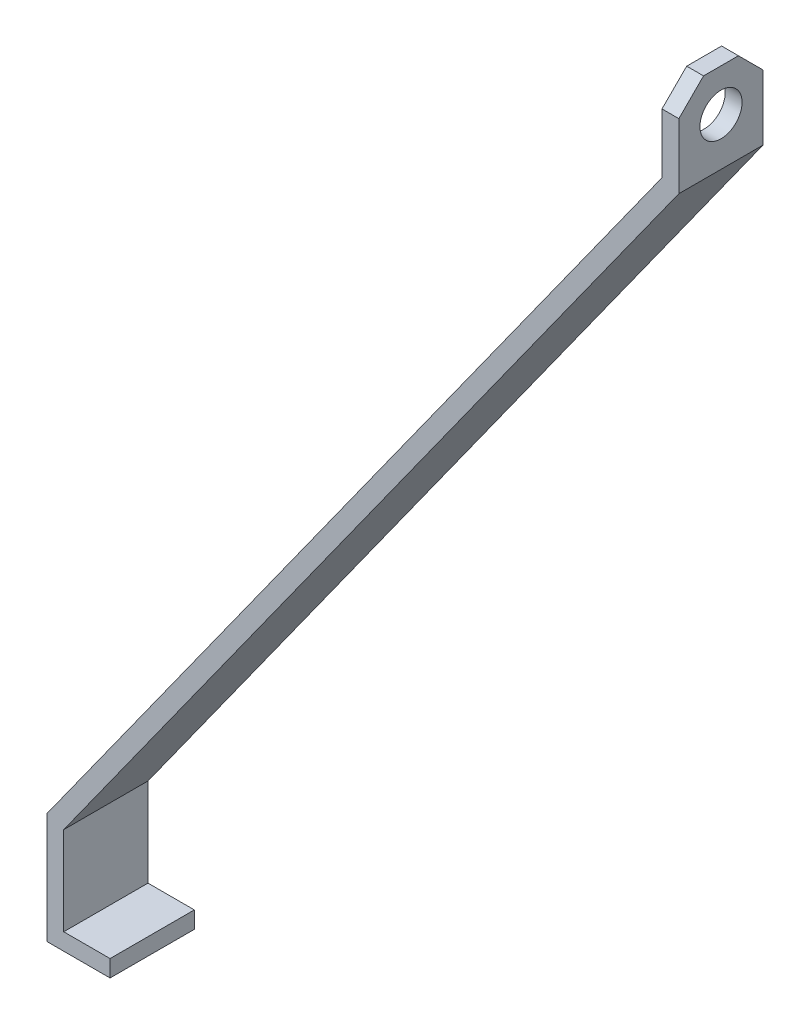
ISO-10303-21;
HEADER;
FILE_DESCRIPTION(('STEP AP214'),'2;1');
FILE_NAME('part.step','',(''),(''),'','','');
FILE_SCHEMA(('AUTOMOTIVE_DESIGN { 1 0 10303 214 1 1 1 1 }'));
ENDSEC;
DATA;
#1=APPLICATION_CONTEXT('core data for automotive mechanical design processes');
#2=APPLICATION_PROTOCOL_DEFINITION('international standard','automotive_design',2000,#1);
#3=PRODUCT_CONTEXT('',#1,'mechanical');
#4=PRODUCT('Part','Part','',(#3));
#5=PRODUCT_RELATED_PRODUCT_CATEGORY('part','',(#4));
#6=PRODUCT_DEFINITION_FORMATION('','',#4);
#7=PRODUCT_DEFINITION_CONTEXT('part definition',#1,'design');
#8=PRODUCT_DEFINITION('design','',#6,#7);
#9=PRODUCT_DEFINITION_SHAPE('','',#8);
#10=(LENGTH_UNIT() NAMED_UNIT(*) SI_UNIT(.MILLI.,.METRE.));
#11=(NAMED_UNIT(*) PLANE_ANGLE_UNIT() SI_UNIT($,.RADIAN.));
#12=(NAMED_UNIT(*) SI_UNIT($,.STERADIAN.) SOLID_ANGLE_UNIT());
#13=UNCERTAINTY_MEASURE_WITH_UNIT(LENGTH_MEASURE(1.E-05),#10,'distance_accuracy_value','');
#14=(GEOMETRIC_REPRESENTATION_CONTEXT(3) GLOBAL_UNCERTAINTY_ASSIGNED_CONTEXT((#13)) GLOBAL_UNIT_ASSIGNED_CONTEXT((#10,
#11,#12)) REPRESENTATION_CONTEXT('',''));
#15=CARTESIAN_POINT('',(0.,0.,0.));
#16=DIRECTION('',(0.,0.,1.));
#17=DIRECTION('',(1.,0.,0.));
#18=AXIS2_PLACEMENT_3D('',#15,#16,#17);
#19=CARTESIAN_POINT('',(1.6,0.,8.));
#20=DIRECTION('',(0.,-1.,0.));
#21=DIRECTION('',(1.,0.,0.));
#22=AXIS2_PLACEMENT_3D('',#19,#20,#21);
#23=PLANE('',#22);
#24=DIRECTION('',(0.,0.,-1.));
#25=VECTOR('',#24,1.);
#26=CARTESIAN_POINT('',(0.,0.,8.));
#27=LINE('',#26,#25);
#28=CARTESIAN_POINT('',(0.,0.,5.65685424949239));
#29=VERTEX_POINT('',#28);
#30=CARTESIAN_POINT('',(0.,0.,2.34314575050761));
#31=VERTEX_POINT('',#30);
#32=EDGE_CURVE('E11',#29,#31,#27,.T.);
#33=ORIENTED_EDGE('',*,*,#32,.F.);
#34=DIRECTION('',(-1.,0.,0.));
#35=VECTOR('',#34,1.);
#36=CARTESIAN_POINT('',(1.6,0.,5.65685424949239));
#37=LINE('',#36,#35);
#38=CARTESIAN_POINT('',(1.6,0.,5.65685424949239));
#39=VERTEX_POINT('',#38);
#40=EDGE_CURVE('E122',#39,#29,#37,.T.);
#41=ORIENTED_EDGE('',*,*,#40,.F.);
#42=DIRECTION('',(0.,0.,-1.));
#43=VECTOR('',#42,1.);
#44=CARTESIAN_POINT('',(1.6,0.,8.));
#45=LINE('',#44,#43);
#46=CARTESIAN_POINT('',(1.6,0.,2.34314575050761));
#47=VERTEX_POINT('',#46);
#48=EDGE_CURVE('E132',#39,#47,#45,.T.);
#49=ORIENTED_EDGE('',*,*,#48,.T.);
#50=DIRECTION('',(-1.,0.,0.));
#51=VECTOR('',#50,1.);
#52=CARTESIAN_POINT('',(1.6,0.,2.34314575050761));
#53=LINE('',#52,#51);
#54=EDGE_CURVE('E226',#47,#31,#53,.T.);
#55=ORIENTED_EDGE('',*,*,#54,.T.);
#56=EDGE_LOOP('',(#33,#41,#49,#55));
#57=FACE_BOUND('',#56,.T.);
#58=ADVANCED_FACE('F33',(#57),#23,.F.);
#59=CARTESIAN_POINT('',(0.,0.,8.));
#60=DIRECTION('',(1.,0.,0.));
#61=DIRECTION('',(0.,1.,0.));
#62=AXIS2_PLACEMENT_3D('',#59,#60,#61);
#63=PLANE('',#62);
#64=CARTESIAN_POINT('',(0.,-4.,4.));
#65=DIRECTION('',(-1.,0.,0.));
#66=DIRECTION('',(0.,-1.,0.));
#67=AXIS2_PLACEMENT_3D('',#64,#65,#66);
#68=CIRCLE('',#67,2.);
#69=CARTESIAN_POINT('',(0.,-6.,4.));
#70=VERTEX_POINT('',#69);
#71=EDGE_CURVE('E205',#70,#70,#68,.T.);
#72=ORIENTED_EDGE('',*,*,#71,.F.);
#73=EDGE_LOOP('',(#72));
#74=FACE_BOUND('',#73,.T.);
#75=DIRECTION('',(0.,-1.,0.));
#76=VECTOR('',#75,1.);
#77=CARTESIAN_POINT('',(0.,0.,8.));
#78=LINE('',#77,#76);
#79=CARTESIAN_POINT('',(0.,-2.34314575050763,8.));
#80=VERTEX_POINT('',#79);
#81=CARTESIAN_POINT('',(0.,-8.,8.));
#82=VERTEX_POINT('',#81);
#83=EDGE_CURVE('E198',#80,#82,#78,.T.);
#84=ORIENTED_EDGE('',*,*,#83,.F.);
#85=DIRECTION('',(0.,-0.707106781186551,0.707106781186544));
#86=VECTOR('',#85,1.);
#87=CARTESIAN_POINT('',(0.,-2.34314575050763,8.));
#88=LINE('',#87,#86);
#89=EDGE_CURVE('E47',#29,#80,#88,.T.);
#90=ORIENTED_EDGE('',*,*,#89,.F.);
#91=ORIENTED_EDGE('',*,*,#32,.T.);
#92=DIRECTION('',(0.,0.707106781186552,0.707106781186543));
#93=VECTOR('',#92,1.);
#94=CARTESIAN_POINT('',(0.,-2.34314575050763,0.));
#95=LINE('',#94,#93);
#96=CARTESIAN_POINT('',(0.,-2.34314575050763,0.));
#97=VERTEX_POINT('',#96);
#98=EDGE_CURVE('E229',#97,#31,#95,.T.);
#99=ORIENTED_EDGE('',*,*,#98,.F.);
#100=DIRECTION('',(0.,-1.,0.));
#101=VECTOR('',#100,1.);
#102=CARTESIAN_POINT('',(0.,0.,0.));
#103=LINE('',#102,#101);
#104=CARTESIAN_POINT('',(0.,-8.,0.));
#105=VERTEX_POINT('',#104);
#106=EDGE_CURVE('E179',#97,#105,#103,.T.);
#107=ORIENTED_EDGE('',*,*,#106,.T.);
#108=DIRECTION('',(0.,0.,-1.));
#109=VECTOR('',#108,1.);
#110=CARTESIAN_POINT('',(0.,-8.,8.));
#111=LINE('',#110,#109);
#112=EDGE_CURVE('E40',#82,#105,#111,.T.);
#113=ORIENTED_EDGE('',*,*,#112,.F.);
#114=EDGE_LOOP('',(#84,#90,#91,#99,#107,#113));
#115=FACE_BOUND('',#114,.T.);
#116=ADVANCED_FACE('F240',(#74,#115),#63,.F.);
#117=CARTESIAN_POINT('',(0.,-8.,8.));
#118=DIRECTION('',(0.812808602424598,-0.582530836801428,0.));
#119=DIRECTION('',(0.582530836801428,0.812808602424598,0.));
#120=AXIS2_PLACEMENT_3D('',#117,#118,#119);
#121=PLANE('',#120);
#122=DIRECTION('',(-0.582530836801428,-0.812808602424598,0.));
#123=VECTOR('',#122,1.);
#124=CARTESIAN_POINT('',(0.,-8.,0.));
#125=LINE('',#124,#123);
#126=CARTESIAN_POINT('',(-58.4,-89.4858534223439,0.));
#127=VERTEX_POINT('',#126);
#128=EDGE_CURVE('E171',#105,#127,#125,.T.);
#129=ORIENTED_EDGE('',*,*,#128,.T.);
#130=DIRECTION('',(0.,0.,-1.));
#131=VECTOR('',#130,1.);
#132=CARTESIAN_POINT('',(-58.4,-89.4858534223439,8.));
#133=LINE('',#132,#131);
#134=CARTESIAN_POINT('',(-58.4,-89.4858534223439,8.));
#135=VERTEX_POINT('',#134);
#136=EDGE_CURVE('E162',#135,#127,#133,.T.);
#137=ORIENTED_EDGE('',*,*,#136,.F.);
#138=DIRECTION('',(-0.582530836801428,-0.812808602424598,0.));
#139=VECTOR('',#138,1.);
#140=CARTESIAN_POINT('',(0.,-8.,8.));
#141=LINE('',#140,#139);
#142=EDGE_CURVE('E172',#82,#135,#141,.T.);
#143=ORIENTED_EDGE('',*,*,#142,.F.);
#144=ORIENTED_EDGE('',*,*,#112,.T.);
#145=EDGE_LOOP('',(#129,#137,#143,#144));
#146=FACE_BOUND('',#145,.T.);
#147=ADVANCED_FACE('F169',(#146),#121,.F.);
#148=CARTESIAN_POINT('',(-58.4,-89.4858534223439,8.));
#149=DIRECTION('',(1.,0.,0.));
#150=DIRECTION('',(0.,0.,-1.));
#151=AXIS2_PLACEMENT_3D('',#148,#149,#150);
#152=PLANE('',#151);
#153=DIRECTION('',(0.,-1.,0.));
#154=VECTOR('',#153,1.);
#155=CARTESIAN_POINT('',(-58.4,-89.4858534223439,0.));
#156=LINE('',#155,#154);
#157=CARTESIAN_POINT('',(-58.4,-100.,0.));
#158=VERTEX_POINT('',#157);
#159=EDGE_CURVE('E181',#127,#158,#156,.T.);
#160=ORIENTED_EDGE('',*,*,#159,.T.);
#161=DIRECTION('',(0.,0.,-1.));
#162=VECTOR('',#161,1.);
#163=CARTESIAN_POINT('',(-58.4,-100.,8.));
#164=LINE('',#163,#162);
#165=CARTESIAN_POINT('',(-58.4,-100.,8.));
#166=VERTEX_POINT('',#165);
#167=EDGE_CURVE('E159',#166,#158,#164,.T.);
#168=ORIENTED_EDGE('',*,*,#167,.F.);
#169=DIRECTION('',(0.,-1.,0.));
#170=VECTOR('',#169,1.);
#171=CARTESIAN_POINT('',(-58.4,-89.4858534223439,8.));
#172=LINE('',#171,#170);
#173=EDGE_CURVE('E202',#135,#166,#172,.T.);
#174=ORIENTED_EDGE('',*,*,#173,.F.);
#175=ORIENTED_EDGE('',*,*,#136,.T.);
#176=EDGE_LOOP('',(#160,#168,#174,#175));
#177=FACE_BOUND('',#176,.T.);
#178=ADVANCED_FACE('F269',(#177),#152,.F.);
#179=CARTESIAN_POINT('',(-58.4,-100.,8.));
#180=DIRECTION('',(0.,1.,0.));
#181=DIRECTION('',(0.,0.,1.));
#182=AXIS2_PLACEMENT_3D('',#179,#180,#181);
#183=PLANE('',#182);
#184=DIRECTION('',(1.,0.,0.));
#185=VECTOR('',#184,1.);
#186=CARTESIAN_POINT('',(-58.4,-100.,0.));
#187=LINE('',#186,#185);
#188=CARTESIAN_POINT('',(-52.4,-100.,0.));
#189=VERTEX_POINT('',#188);
#190=EDGE_CURVE('E183',#158,#189,#187,.T.);
#191=ORIENTED_EDGE('',*,*,#190,.T.);
#192=DIRECTION('',(0.,0.,-1.));
#193=VECTOR('',#192,1.);
#194=CARTESIAN_POINT('',(-52.4,-100.,8.));
#195=LINE('',#194,#193);
#196=CARTESIAN_POINT('',(-52.4,-100.,8.));
#197=VERTEX_POINT('',#196);
#198=EDGE_CURVE('E156',#197,#189,#195,.T.);
#199=ORIENTED_EDGE('',*,*,#198,.F.);
#200=DIRECTION('',(1.,0.,0.));
#201=VECTOR('',#200,1.);
#202=CARTESIAN_POINT('',(-58.4,-100.,8.));
#203=LINE('',#202,#201);
#204=EDGE_CURVE('E209',#166,#197,#203,.T.);
#205=ORIENTED_EDGE('',*,*,#204,.F.);
#206=ORIENTED_EDGE('',*,*,#167,.T.);
#207=EDGE_LOOP('',(#191,#199,#205,#206));
#208=FACE_BOUND('',#207,.T.);
#209=ADVANCED_FACE('F276',(#208),#183,.F.);
#210=CARTESIAN_POINT('',(-52.4,-98.4,8.));
#211=DIRECTION('',(-1.,0.,0.));
#212=DIRECTION('',(0.,0.,1.));
#213=AXIS2_PLACEMENT_3D('',#210,#211,#212);
#214=PLANE('',#213);
#215=DIRECTION('',(0.,1.,0.));
#216=VECTOR('',#215,1.);
#217=CARTESIAN_POINT('',(-52.4,-98.4,0.));
#218=LINE('',#217,#216);
#219=CARTESIAN_POINT('',(-52.4,-98.4,0.));
#220=VERTEX_POINT('',#219);
#221=EDGE_CURVE('E189',#189,#220,#218,.T.);
#222=ORIENTED_EDGE('',*,*,#221,.T.);
#223=DIRECTION('',(0.,0.,-1.));
#224=VECTOR('',#223,1.);
#225=CARTESIAN_POINT('',(-52.4,-98.4,8.));
#226=LINE('',#225,#224);
#227=CARTESIAN_POINT('',(-52.4,-98.4,8.));
#228=VERTEX_POINT('',#227);
#229=EDGE_CURVE('E153',#228,#220,#226,.T.);
#230=ORIENTED_EDGE('',*,*,#229,.F.);
#231=DIRECTION('',(0.,1.,0.));
#232=VECTOR('',#231,1.);
#233=CARTESIAN_POINT('',(-52.4,-98.4,8.));
#234=LINE('',#233,#232);
#235=EDGE_CURVE('E211',#197,#228,#234,.T.);
#236=ORIENTED_EDGE('',*,*,#235,.F.);
#237=ORIENTED_EDGE('',*,*,#198,.T.);
#238=EDGE_LOOP('',(#222,#230,#236,#237));
#239=FACE_BOUND('',#238,.T.);
#240=ADVANCED_FACE('F284',(#239),#214,.F.);
#241=CARTESIAN_POINT('',(-56.8,-98.4,8.));
#242=DIRECTION('',(0.,-1.,0.));
#243=DIRECTION('',(0.,0.,-1.));
#244=AXIS2_PLACEMENT_3D('',#241,#242,#243);
#245=PLANE('',#244);
#246=DIRECTION('',(-1.,0.,0.));
#247=VECTOR('',#246,1.);
#248=CARTESIAN_POINT('',(-56.8,-98.4,0.));
#249=LINE('',#248,#247);
#250=CARTESIAN_POINT('',(-56.8,-98.4,0.));
#251=VERTEX_POINT('',#250);
#252=EDGE_CURVE('E191',#220,#251,#249,.T.);
#253=ORIENTED_EDGE('',*,*,#252,.T.);
#254=DIRECTION('',(0.,0.,-1.));
#255=VECTOR('',#254,1.);
#256=CARTESIAN_POINT('',(-56.8,-98.4,8.));
#257=LINE('',#256,#255);
#258=CARTESIAN_POINT('',(-56.8,-98.4,8.));
#259=VERTEX_POINT('',#258);
#260=EDGE_CURVE('E150',#259,#251,#257,.T.);
#261=ORIENTED_EDGE('',*,*,#260,.F.);
#262=DIRECTION('',(-1.,0.,0.));
#263=VECTOR('',#262,1.);
#264=CARTESIAN_POINT('',(-56.8,-98.4,8.));
#265=LINE('',#264,#263);
#266=EDGE_CURVE('E213',#228,#259,#265,.T.);
#267=ORIENTED_EDGE('',*,*,#266,.F.);
#268=ORIENTED_EDGE('',*,*,#229,.T.);
#269=EDGE_LOOP('',(#253,#261,#267,#268));
#270=FACE_BOUND('',#269,.T.);
#271=ADVANCED_FACE('F292',(#270),#245,.F.);
#272=CARTESIAN_POINT('',(-56.8,-90.,8.));
#273=DIRECTION('',(-1.,0.,0.));
#274=DIRECTION('',(0.,0.,1.));
#275=AXIS2_PLACEMENT_3D('',#272,#273,#274);
#276=PLANE('',#275);
#277=DIRECTION('',(0.,1.,0.));
#278=VECTOR('',#277,1.);
#279=CARTESIAN_POINT('',(-56.8,-90.,0.));
#280=LINE('',#279,#278);
#281=CARTESIAN_POINT('',(-56.8,-90.,0.));
#282=VERTEX_POINT('',#281);
#283=EDGE_CURVE('E193',#251,#282,#280,.T.);
#284=ORIENTED_EDGE('',*,*,#283,.T.);
#285=DIRECTION('',(0.,0.,-1.));
#286=VECTOR('',#285,1.);
#287=CARTESIAN_POINT('',(-56.8,-90.,8.));
#288=LINE('',#287,#286);
#289=CARTESIAN_POINT('',(-56.8,-90.,8.));
#290=VERTEX_POINT('',#289);
#291=EDGE_CURVE('E140',#290,#282,#288,.T.);
#292=ORIENTED_EDGE('',*,*,#291,.F.);
#293=DIRECTION('',(0.,1.,0.));
#294=VECTOR('',#293,1.);
#295=CARTESIAN_POINT('',(-56.8,-90.,8.));
#296=LINE('',#295,#294);
#297=EDGE_CURVE('E215',#259,#290,#296,.T.);
#298=ORIENTED_EDGE('',*,*,#297,.F.);
#299=ORIENTED_EDGE('',*,*,#260,.T.);
#300=EDGE_LOOP('',(#284,#292,#298,#299));
#301=FACE_BOUND('',#300,.T.);
#302=ADVANCED_FACE('F300',(#301),#276,.F.);
#303=CARTESIAN_POINT('',(-56.8,-90.,8.));
#304=DIRECTION('',(-0.812808602424598,0.582530836801428,0.));
#305=DIRECTION('',(-0.582530836801428,-0.812808602424598,0.));
#306=AXIS2_PLACEMENT_3D('',#303,#304,#305);
#307=PLANE('',#306);
#308=DIRECTION('',(0.582530836801428,0.812808602424598,0.));
#309=VECTOR('',#308,1.);
#310=CARTESIAN_POINT('',(-56.8,-90.,0.));
#311=LINE('',#310,#309);
#312=CARTESIAN_POINT('',(1.6,-8.51414657765615,0.));
#313=VERTEX_POINT('',#312);
#314=EDGE_CURVE('E194',#282,#313,#311,.T.);
#315=ORIENTED_EDGE('',*,*,#314,.T.);
#316=DIRECTION('',(0.,0.,-1.));
#317=VECTOR('',#316,1.);
#318=CARTESIAN_POINT('',(1.6,-8.51414657765615,8.));
#319=LINE('',#318,#317);
#320=CARTESIAN_POINT('',(1.6,-8.51414657765615,8.));
#321=VERTEX_POINT('',#320);
#322=EDGE_CURVE('E136',#321,#313,#319,.T.);
#323=ORIENTED_EDGE('',*,*,#322,.F.);
#324=DIRECTION('',(0.582530836801428,0.812808602424598,0.));
#325=VECTOR('',#324,1.);
#326=CARTESIAN_POINT('',(-56.8,-90.,8.));
#327=LINE('',#326,#325);
#328=EDGE_CURVE('E142',#290,#321,#327,.T.);
#329=ORIENTED_EDGE('',*,*,#328,.F.);
#330=ORIENTED_EDGE('',*,*,#291,.T.);
#331=EDGE_LOOP('',(#315,#323,#329,#330));
#332=FACE_BOUND('',#331,.T.);
#333=ADVANCED_FACE('F221',(#332),#307,.F.);
#334=CARTESIAN_POINT('',(1.6,-8.51414657765615,8.));
#335=DIRECTION('',(-1.,0.,0.));
#336=DIRECTION('',(0.,-1.,0.));
#337=AXIS2_PLACEMENT_3D('',#334,#335,#336);
#338=PLANE('',#337);
#339=CARTESIAN_POINT('',(1.6,-4.,4.));
#340=DIRECTION('',(-1.,0.,0.));
#341=DIRECTION('',(0.,-1.,0.));
#342=AXIS2_PLACEMENT_3D('',#339,#340,#341);
#343=CIRCLE('',#342,2.);
#344=CARTESIAN_POINT('',(1.6,-6.,4.));
#345=VERTEX_POINT('',#344);
#346=EDGE_CURVE('E185',#345,#345,#343,.T.);
#347=ORIENTED_EDGE('',*,*,#346,.T.);
#348=EDGE_LOOP('',(#347));
#349=FACE_BOUND('',#348,.T.);
#350=ORIENTED_EDGE('',*,*,#48,.F.);
#351=DIRECTION('',(0.,-0.707106781186551,0.707106781186544));
#352=VECTOR('',#351,1.);
#353=CARTESIAN_POINT('',(1.6,-2.34314575050763,8.));
#354=LINE('',#353,#352);
#355=CARTESIAN_POINT('',(1.6,-2.34314575050763,8.));
#356=VERTEX_POINT('',#355);
#357=EDGE_CURVE('E119',#39,#356,#354,.T.);
#358=ORIENTED_EDGE('',*,*,#357,.T.);
#359=DIRECTION('',(0.,1.,0.));
#360=VECTOR('',#359,1.);
#361=CARTESIAN_POINT('',(1.6,-8.51414657765615,8.));
#362=LINE('',#361,#360);
#363=EDGE_CURVE('E137',#321,#356,#362,.T.);
#364=ORIENTED_EDGE('',*,*,#363,.F.);
#365=ORIENTED_EDGE('',*,*,#322,.T.);
#366=DIRECTION('',(0.,1.,0.));
#367=VECTOR('',#366,1.);
#368=CARTESIAN_POINT('',(1.6,-8.51414657765615,0.));
#369=LINE('',#368,#367);
#370=CARTESIAN_POINT('',(1.6,-2.34314575050763,0.));
#371=VERTEX_POINT('',#370);
#372=EDGE_CURVE('E145',#313,#371,#369,.T.);
#373=ORIENTED_EDGE('',*,*,#372,.T.);
#374=DIRECTION('',(0.,0.707106781186552,0.707106781186543));
#375=VECTOR('',#374,1.);
#376=CARTESIAN_POINT('',(1.6,-2.34314575050763,0.));
#377=LINE('',#376,#375);
#378=EDGE_CURVE('E55',#371,#47,#377,.T.);
#379=ORIENTED_EDGE('',*,*,#378,.T.);
#380=EDGE_LOOP('',(#350,#358,#364,#365,#373,#379));
#381=FACE_BOUND('',#380,.T.);
#382=ADVANCED_FACE('F134',(#349,#381),#338,.F.);
#383=CARTESIAN_POINT('',(0.,0.,8.));
#384=DIRECTION('',(0.,0.,1.));
#385=DIRECTION('',(1.,0.,0.));
#386=AXIS2_PLACEMENT_3D('',#383,#384,#385);
#387=PLANE('',#386);
#388=DIRECTION('',(-1.,0.,0.));
#389=VECTOR('',#388,1.);
#390=CARTESIAN_POINT('',(1.6,-2.34314575050763,8.));
#391=LINE('',#390,#389);
#392=EDGE_CURVE('E123',#356,#80,#391,.T.);
#393=ORIENTED_EDGE('',*,*,#392,.T.);
#394=ORIENTED_EDGE('',*,*,#83,.T.);
#395=ORIENTED_EDGE('',*,*,#142,.T.);
#396=ORIENTED_EDGE('',*,*,#173,.T.);
#397=ORIENTED_EDGE('',*,*,#204,.T.);
#398=ORIENTED_EDGE('',*,*,#235,.T.);
#399=ORIENTED_EDGE('',*,*,#266,.T.);
#400=ORIENTED_EDGE('',*,*,#297,.T.);
#401=ORIENTED_EDGE('',*,*,#328,.T.);
#402=ORIENTED_EDGE('',*,*,#363,.T.);
#403=EDGE_LOOP('',(#393,#394,#395,#396,#397,#398,#399,#400,#401,#402));
#404=FACE_BOUND('',#403,.T.);
#405=ADVANCED_FACE('F218',(#404),#387,.T.);
#406=CARTESIAN_POINT('',(0.,0.,0.));
#407=DIRECTION('',(0.,0.,1.));
#408=DIRECTION('',(1.,0.,0.));
#409=AXIS2_PLACEMENT_3D('',#406,#407,#408);
#410=PLANE('',#409);
#411=ORIENTED_EDGE('',*,*,#106,.F.);
#412=DIRECTION('',(-1.,0.,0.));
#413=VECTOR('',#412,1.);
#414=CARTESIAN_POINT('',(1.6,-2.34314575050763,0.));
#415=LINE('',#414,#413);
#416=EDGE_CURVE('E223',#371,#97,#415,.T.);
#417=ORIENTED_EDGE('',*,*,#416,.F.);
#418=ORIENTED_EDGE('',*,*,#372,.F.);
#419=ORIENTED_EDGE('',*,*,#314,.F.);
#420=ORIENTED_EDGE('',*,*,#283,.F.);
#421=ORIENTED_EDGE('',*,*,#252,.F.);
#422=ORIENTED_EDGE('',*,*,#221,.F.);
#423=ORIENTED_EDGE('',*,*,#190,.F.);
#424=ORIENTED_EDGE('',*,*,#159,.F.);
#425=ORIENTED_EDGE('',*,*,#128,.F.);
#426=EDGE_LOOP('',(#411,#417,#418,#419,#420,#421,#422,#423,#424,#425));
#427=FACE_BOUND('',#426,.T.);
#428=ADVANCED_FACE('F178',(#427),#410,.F.);
#429=CARTESIAN_POINT('',(1.6,-4.,4.));
#430=DIRECTION('',(-1.,0.,0.));
#431=DIRECTION('',(0.,-1.,0.));
#432=AXIS2_PLACEMENT_3D('',#429,#430,#431);
#433=CYLINDRICAL_SURFACE('',#432,2.);
#434=ORIENTED_EDGE('',*,*,#346,.F.);
#435=EDGE_LOOP('',(#434));
#436=FACE_BOUND('',#435,.T.);
#437=ORIENTED_EDGE('',*,*,#71,.T.);
#438=EDGE_LOOP('',(#437));
#439=FACE_BOUND('',#438,.T.);
#440=ADVANCED_FACE('F238',(#436,#439),#433,.F.);
#441=CARTESIAN_POINT('',(1.6,-2.34314575050763,0.));
#442=DIRECTION('',(0.,-0.707106781186544,0.707106781186552));
#443=DIRECTION('',(0.,-0.707106781186552,-0.707106781186544));
#444=AXIS2_PLACEMENT_3D('',#441,#442,#443);
#445=PLANE('',#444);
#446=ORIENTED_EDGE('',*,*,#98,.T.);
#447=ORIENTED_EDGE('',*,*,#54,.F.);
#448=ORIENTED_EDGE('',*,*,#378,.F.);
#449=ORIENTED_EDGE('',*,*,#416,.T.);
#450=EDGE_LOOP('',(#446,#447,#448,#449));
#451=FACE_BOUND('',#450,.T.);
#452=ADVANCED_FACE('F244',(#451),#445,.F.);
#453=CARTESIAN_POINT('',(1.6,-2.34314575050763,8.));
#454=DIRECTION('',(0.,-0.707106781186544,-0.707106781186551));
#455=DIRECTION('',(0.,0.707106781186551,-0.707106781186544));
#456=AXIS2_PLACEMENT_3D('',#453,#454,#455);
#457=PLANE('',#456);
#458=ORIENTED_EDGE('',*,*,#89,.T.);
#459=ORIENTED_EDGE('',*,*,#392,.F.);
#460=ORIENTED_EDGE('',*,*,#357,.F.);
#461=ORIENTED_EDGE('',*,*,#40,.T.);
#462=EDGE_LOOP('',(#458,#459,#460,#461));
#463=FACE_BOUND('',#462,.T.);
#464=ADVANCED_FACE('F121',(#463),#457,.F.);
#465=CLOSED_SHELL('',(#58,#116,#147,#178,#209,#240,#271,#302,#333,#382,#405,#428,#440,#452,#464));
#466=MANIFOLD_SOLID_BREP('B2',#465);
#467=ADVANCED_BREP_SHAPE_REPRESENTATION('',(#18,#466),#14);
#468=SHAPE_DEFINITION_REPRESENTATION(#9,#467);
ENDSEC;
END-ISO-10303-21;
